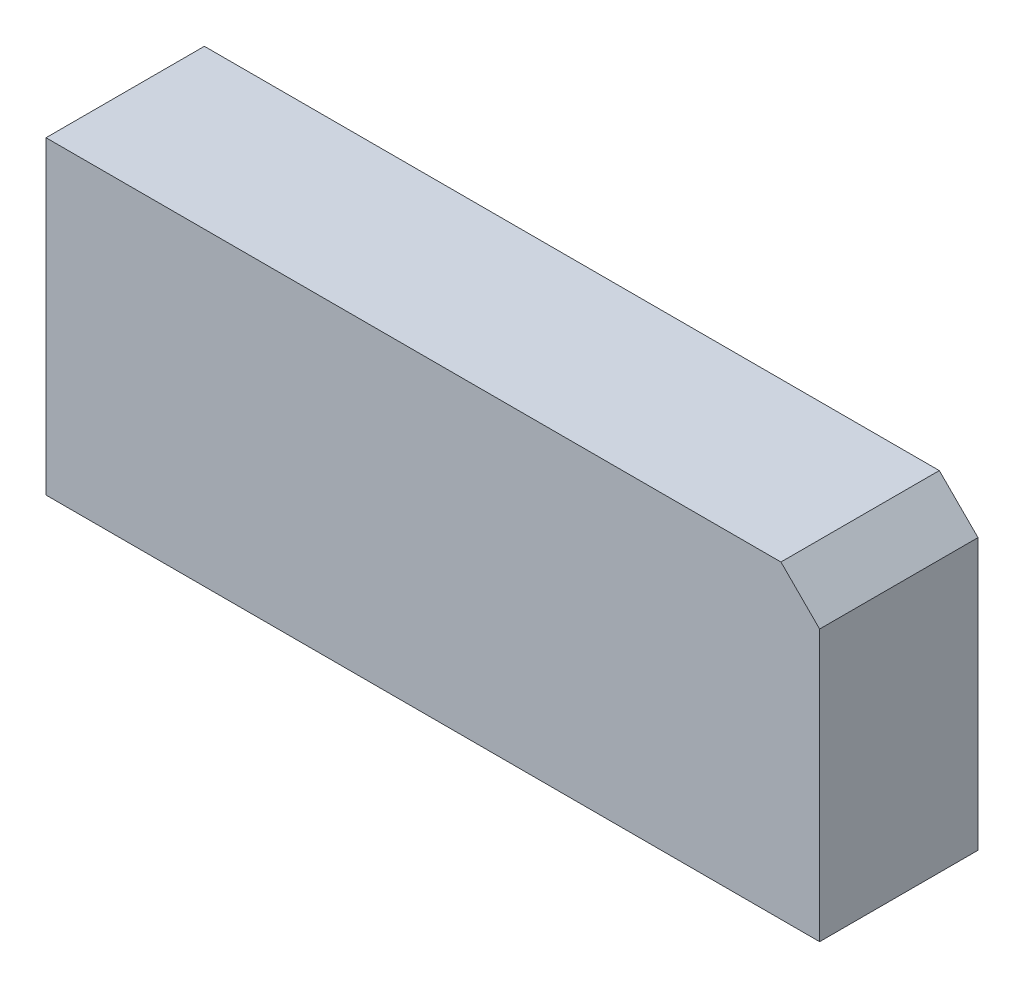
ISO-10303-21;
HEADER;
FILE_DESCRIPTION(('STEP AP214'),'2;1');
FILE_NAME('part.step','',(''),(''),'','','');
FILE_SCHEMA(('AUTOMOTIVE_DESIGN { 1 0 10303 214 1 1 1 1 }'));
ENDSEC;
DATA;
#1=APPLICATION_CONTEXT('core data for automotive mechanical design processes');
#2=APPLICATION_PROTOCOL_DEFINITION('international standard','automotive_design',2000,#1);
#3=PRODUCT_CONTEXT('',#1,'mechanical');
#4=PRODUCT('Part','Part','',(#3));
#5=PRODUCT_RELATED_PRODUCT_CATEGORY('part','',(#4));
#6=PRODUCT_DEFINITION_FORMATION('','',#4);
#7=PRODUCT_DEFINITION_CONTEXT('part definition',#1,'design');
#8=PRODUCT_DEFINITION('design','',#6,#7);
#9=PRODUCT_DEFINITION_SHAPE('','',#8);
#10=(LENGTH_UNIT() NAMED_UNIT(*) SI_UNIT(.MILLI.,.METRE.));
#11=(NAMED_UNIT(*) PLANE_ANGLE_UNIT() SI_UNIT($,.RADIAN.));
#12=(NAMED_UNIT(*) SI_UNIT($,.STERADIAN.) SOLID_ANGLE_UNIT());
#13=UNCERTAINTY_MEASURE_WITH_UNIT(LENGTH_MEASURE(1.E-05),#10,'distance_accuracy_value','');
#14=(GEOMETRIC_REPRESENTATION_CONTEXT(3) GLOBAL_UNCERTAINTY_ASSIGNED_CONTEXT((#13)) GLOBAL_UNIT_ASSIGNED_CONTEXT((#10,
#11,#12)) REPRESENTATION_CONTEXT('',''));
#15=CARTESIAN_POINT('',(0.,0.,0.));
#16=DIRECTION('',(0.,0.,1.));
#17=DIRECTION('',(1.,0.,0.));
#18=AXIS2_PLACEMENT_3D('',#15,#16,#17);
#19=CARTESIAN_POINT('',(-6.35,2.540508,2.59999988));
#20=DIRECTION('',(0.,0.,1.));
#21=DIRECTION('',(1.,0.,0.));
#22=AXIS2_PLACEMENT_3D('',#19,#20,#21);
#23=PLANE('',#22);
#24=DIRECTION('',(-0.707106781186548,0.707106781186548,0.));
#25=VECTOR('',#24,1.);
#26=CARTESIAN_POINT('',(5.71520828,2.540508,2.59999988));
#27=LINE('',#26,#25);
#28=CARTESIAN_POINT('',(5.71520828,2.540508,2.59999988));
#29=VERTEX_POINT('',#28);
#30=CARTESIAN_POINT('',(6.350508,1.90520828,2.59999988));
#31=VERTEX_POINT('',#30);
#32=EDGE_CURVE('E46',#29,#31,#27,.F.);
#33=ORIENTED_EDGE('',*,*,#32,.F.);
#34=DIRECTION('',(1.,0.,0.));
#35=VECTOR('',#34,1.);
#36=CARTESIAN_POINT('',(-6.35,2.540508,2.59999988));
#37=LINE('',#36,#35);
#38=CARTESIAN_POINT('',(-6.350254,2.540254,2.59999988));
#39=VERTEX_POINT('',#38);
#40=EDGE_CURVE('E73',#39,#29,#37,.T.);
#41=ORIENTED_EDGE('',*,*,#40,.F.);
#42=DIRECTION('',(0.,1.,0.));
#43=VECTOR('',#42,1.);
#44=CARTESIAN_POINT('',(-6.350508,-2.540508,2.59999988));
#45=LINE('',#44,#43);
#46=CARTESIAN_POINT('',(-6.350508,-2.540508,2.59999988));
#47=VERTEX_POINT('',#46);
#48=EDGE_CURVE('E68',#47,#39,#45,.T.);
#49=ORIENTED_EDGE('',*,*,#48,.F.);
#50=DIRECTION('',(1.,0.,0.));
#51=VECTOR('',#50,1.);
#52=CARTESIAN_POINT('',(6.350508,-2.540508,2.59999988));
#53=LINE('',#52,#51);
#54=CARTESIAN_POINT('',(6.350508,-2.540508,2.59999988));
#55=VERTEX_POINT('',#54);
#56=EDGE_CURVE('E56',#55,#47,#53,.F.);
#57=ORIENTED_EDGE('',*,*,#56,.F.);
#58=DIRECTION('',(0.,1.,0.));
#59=VECTOR('',#58,1.);
#60=CARTESIAN_POINT('',(6.350508,1.90520828,2.59999988));
#61=LINE('',#60,#59);
#62=EDGE_CURVE('E84',#31,#55,#61,.F.);
#63=ORIENTED_EDGE('',*,*,#62,.F.);
#64=EDGE_LOOP('',(#33,#41,#49,#57,#63));
#65=FACE_BOUND('',#64,.T.);
#66=ADVANCED_FACE('F17',(#65),#23,.T.);
#67=CARTESIAN_POINT('',(5.71520828,2.540508,0.));
#68=DIRECTION('',(0.707106781186548,0.707106781186548,0.));
#69=DIRECTION('',(-0.707106781186548,0.707106781186548,0.));
#70=AXIS2_PLACEMENT_3D('',#67,#68,#69);
#71=PLANE('',#70);
#72=DIRECTION('',(0.,0.,-1.));
#73=VECTOR('',#72,1.);
#74=CARTESIAN_POINT('',(6.350508,1.90520828,0.));
#75=LINE('',#74,#73);
#76=CARTESIAN_POINT('',(6.350508,1.90520828,0.));
#77=VERTEX_POINT('',#76);
#78=EDGE_CURVE('E82',#77,#31,#75,.F.);
#79=ORIENTED_EDGE('',*,*,#78,.F.);
#80=DIRECTION('',(-0.707106781186548,0.707106781186548,0.));
#81=VECTOR('',#80,1.);
#82=CARTESIAN_POINT('',(5.71520828,2.540508,0.));
#83=LINE('',#82,#81);
#84=CARTESIAN_POINT('',(5.71520828,2.540508,0.));
#85=VERTEX_POINT('',#84);
#86=EDGE_CURVE('E35',#77,#85,#83,.T.);
#87=ORIENTED_EDGE('',*,*,#86,.T.);
#88=DIRECTION('',(0.,0.,1.));
#89=VECTOR('',#88,1.);
#90=CARTESIAN_POINT('',(5.71520828,2.540508,0.));
#91=LINE('',#90,#89);
#92=EDGE_CURVE('E99',#29,#85,#91,.F.);
#93=ORIENTED_EDGE('',*,*,#92,.F.);
#94=ORIENTED_EDGE('',*,*,#32,.T.);
#95=EDGE_LOOP('',(#79,#87,#93,#94));
#96=FACE_BOUND('',#95,.T.);
#97=ADVANCED_FACE('F139',(#96),#71,.T.);
#98=CARTESIAN_POINT('',(-6.350508,-2.540508,0.));
#99=DIRECTION('',(-1.,0.,0.));
#100=DIRECTION('',(0.,0.,1.));
#101=AXIS2_PLACEMENT_3D('',#98,#99,#100);
#102=PLANE('',#101);
#103=DIRECTION('',(0.,0.,1.));
#104=VECTOR('',#103,1.);
#105=CARTESIAN_POINT('',(-6.350508,2.540508,0.));
#106=LINE('',#105,#104);
#107=CARTESIAN_POINT('',(-6.350254,2.540254,0.));
#108=VERTEX_POINT('',#107);
#109=EDGE_CURVE('E100',#108,#39,#106,.T.);
#110=ORIENTED_EDGE('',*,*,#109,.F.);
#111=DIRECTION('',(0.,1.,0.));
#112=VECTOR('',#111,1.);
#113=CARTESIAN_POINT('',(-6.350508,2.540508,0.));
#114=LINE('',#113,#112);
#115=CARTESIAN_POINT('',(-6.350508,-2.540508,0.));
#116=VERTEX_POINT('',#115);
#117=EDGE_CURVE('E81',#108,#116,#114,.F.);
#118=ORIENTED_EDGE('',*,*,#117,.T.);
#119=DIRECTION('',(0.,0.,-1.));
#120=VECTOR('',#119,1.);
#121=CARTESIAN_POINT('',(-6.350508,-2.540508,0.));
#122=LINE('',#121,#120);
#123=EDGE_CURVE('E62',#47,#116,#122,.T.);
#124=ORIENTED_EDGE('',*,*,#123,.F.);
#125=ORIENTED_EDGE('',*,*,#48,.T.);
#126=EDGE_LOOP('',(#110,#118,#124,#125));
#127=FACE_BOUND('',#126,.T.);
#128=ADVANCED_FACE('F79',(#127),#102,.T.);
#129=CARTESIAN_POINT('',(6.350508,-2.540508,0.));
#130=DIRECTION('',(0.,-1.,0.));
#131=DIRECTION('',(0.,0.,-1.));
#132=AXIS2_PLACEMENT_3D('',#129,#130,#131);
#133=PLANE('',#132);
#134=ORIENTED_EDGE('',*,*,#123,.T.);
#135=DIRECTION('',(1.,0.,0.));
#136=VECTOR('',#135,1.);
#137=CARTESIAN_POINT('',(-6.35,-2.540508,0.));
#138=LINE('',#137,#136);
#139=CARTESIAN_POINT('',(6.350508,-2.540508,0.));
#140=VERTEX_POINT('',#139);
#141=EDGE_CURVE('E117',#116,#140,#138,.T.);
#142=ORIENTED_EDGE('',*,*,#141,.T.);
#143=DIRECTION('',(0.,0.,-1.));
#144=VECTOR('',#143,1.);
#145=CARTESIAN_POINT('',(6.350508,-2.540508,0.));
#146=LINE('',#145,#144);
#147=EDGE_CURVE('E65',#55,#140,#146,.T.);
#148=ORIENTED_EDGE('',*,*,#147,.F.);
#149=ORIENTED_EDGE('',*,*,#56,.T.);
#150=EDGE_LOOP('',(#134,#142,#148,#149));
#151=FACE_BOUND('',#150,.T.);
#152=ADVANCED_FACE('F58',(#151),#133,.T.);
#153=CARTESIAN_POINT('',(6.350508,1.90520828,0.));
#154=DIRECTION('',(1.,0.,0.));
#155=DIRECTION('',(0.,0.,-1.));
#156=AXIS2_PLACEMENT_3D('',#153,#154,#155);
#157=PLANE('',#156);
#158=ORIENTED_EDGE('',*,*,#147,.T.);
#159=DIRECTION('',(0.,1.,0.));
#160=VECTOR('',#159,1.);
#161=CARTESIAN_POINT('',(6.350508,2.540508,0.));
#162=LINE('',#161,#160);
#163=EDGE_CURVE('E26',#140,#77,#162,.T.);
#164=ORIENTED_EDGE('',*,*,#163,.T.);
#165=ORIENTED_EDGE('',*,*,#78,.T.);
#166=ORIENTED_EDGE('',*,*,#62,.T.);
#167=EDGE_LOOP('',(#158,#164,#165,#166));
#168=FACE_BOUND('',#167,.T.);
#169=ADVANCED_FACE('F129',(#168),#157,.T.);
#170=CARTESIAN_POINT('',(-6.35,2.540508,0.));
#171=DIRECTION('',(0.,1.,0.));
#172=DIRECTION('',(0.,0.,1.));
#173=AXIS2_PLACEMENT_3D('',#170,#171,#172);
#174=PLANE('',#173);
#175=ORIENTED_EDGE('',*,*,#92,.T.);
#176=DIRECTION('',(1.,0.,0.));
#177=VECTOR('',#176,1.);
#178=CARTESIAN_POINT('',(-6.35,2.540508,0.));
#179=LINE('',#178,#177);
#180=EDGE_CURVE('E11',#85,#108,#179,.F.);
#181=ORIENTED_EDGE('',*,*,#180,.T.);
#182=ORIENTED_EDGE('',*,*,#109,.T.);
#183=ORIENTED_EDGE('',*,*,#40,.T.);
#184=EDGE_LOOP('',(#175,#181,#182,#183));
#185=FACE_BOUND('',#184,.T.);
#186=ADVANCED_FACE('F120',(#185),#174,.T.);
#187=CARTESIAN_POINT('',(-6.35,2.540508,0.));
#188=DIRECTION('',(0.,0.,1.));
#189=DIRECTION('',(1.,0.,0.));
#190=AXIS2_PLACEMENT_3D('',#187,#188,#189);
#191=PLANE('',#190);
#192=ORIENTED_EDGE('',*,*,#86,.F.);
#193=ORIENTED_EDGE('',*,*,#163,.F.);
#194=ORIENTED_EDGE('',*,*,#141,.F.);
#195=ORIENTED_EDGE('',*,*,#117,.F.);
#196=ORIENTED_EDGE('',*,*,#180,.F.);
#197=EDGE_LOOP('',(#192,#193,#194,#195,#196));
#198=FACE_BOUND('',#197,.T.);
#199=ADVANCED_FACE('F130',(#198),#191,.F.);
#200=CLOSED_SHELL('',(#66,#97,#128,#152,#169,#186,#199));
#201=MANIFOLD_SOLID_BREP('B1',#200);
#202=ADVANCED_BREP_SHAPE_REPRESENTATION('',(#18,#201),#14);
#203=SHAPE_DEFINITION_REPRESENTATION(#9,#202);
ENDSEC;
END-ISO-10303-21;
